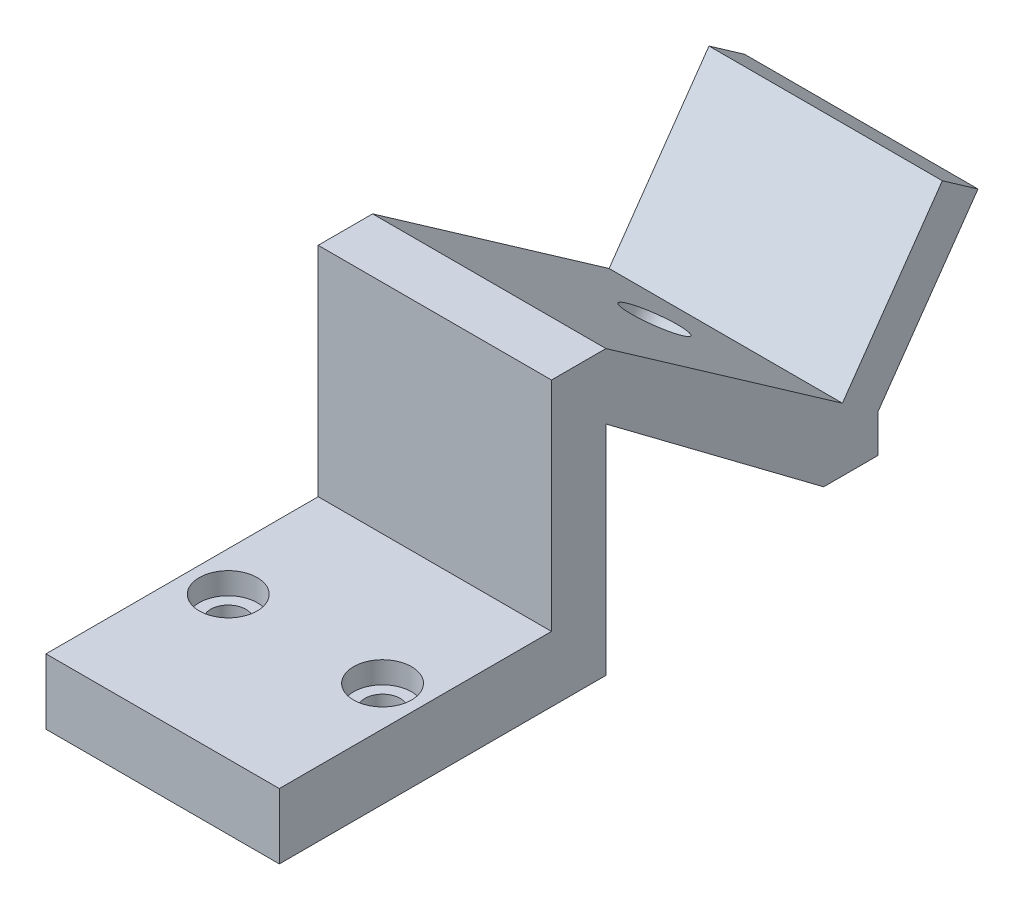
ISO-10303-21;
HEADER;
FILE_DESCRIPTION(('STEP AP214'),'2;1');
FILE_NAME('part.step','',(''),(''),'','','');
FILE_SCHEMA(('AUTOMOTIVE_DESIGN { 1 0 10303 214 1 1 1 1 }'));
ENDSEC;
DATA;
#1=APPLICATION_CONTEXT('core data for automotive mechanical design processes');
#2=APPLICATION_PROTOCOL_DEFINITION('international standard','automotive_design',2000,#1);
#3=PRODUCT_CONTEXT('',#1,'mechanical');
#4=PRODUCT('Part','Part','',(#3));
#5=PRODUCT_RELATED_PRODUCT_CATEGORY('part','',(#4));
#6=PRODUCT_DEFINITION_FORMATION('','',#4);
#7=PRODUCT_DEFINITION_CONTEXT('part definition',#1,'design');
#8=PRODUCT_DEFINITION('design','',#6,#7);
#9=PRODUCT_DEFINITION_SHAPE('','',#8);
#10=(LENGTH_UNIT() NAMED_UNIT(*) SI_UNIT(.MILLI.,.METRE.));
#11=(NAMED_UNIT(*) PLANE_ANGLE_UNIT() SI_UNIT($,.RADIAN.));
#12=(NAMED_UNIT(*) SI_UNIT($,.STERADIAN.) SOLID_ANGLE_UNIT());
#13=UNCERTAINTY_MEASURE_WITH_UNIT(LENGTH_MEASURE(1.E-05),#10,'distance_accuracy_value','');
#14=(GEOMETRIC_REPRESENTATION_CONTEXT(3) GLOBAL_UNCERTAINTY_ASSIGNED_CONTEXT((#13)) GLOBAL_UNIT_ASSIGNED_CONTEXT((#10,
#11,#12)) REPRESENTATION_CONTEXT('',''));
#15=CARTESIAN_POINT('',(0.,0.,0.));
#16=DIRECTION('',(0.,0.,1.));
#17=DIRECTION('',(1.,0.,0.));
#18=AXIS2_PLACEMENT_3D('',#15,#16,#17);
#19=CARTESIAN_POINT('',(-0.3468345323741,9.13032073750534,-41.6646675708252));
#20=DIRECTION('',(0.,0.81923192051904,-0.573462344363328));
#21=DIRECTION('',(0.,0.573462344363328,0.81923192051904));
#22=AXIS2_PLACEMENT_3D('',#19,#20,#21);
#23=CYLINDRICAL_SURFACE('',#22,3.302);
#24=CARTESIAN_POINT('',(-0.346834532374102,19.5345661280972,-48.9476393442395));
#25=DIRECTION('',(0.,0.81923192051904,-0.573462344363329));
#26=DIRECTION('',(0.,0.573462344363329,0.81923192051904));
#27=AXIS2_PLACEMENT_3D('',#24,#25,#26);
#28=CIRCLE('',#27,3.302);
#29=CARTESIAN_POINT('',(-0.346834532374102,21.4281387891849,-46.2425355426856));
#30=VERTEX_POINT('',#29);
#31=EDGE_CURVE('E371',#30,#30,#28,.T.);
#32=ORIENTED_EDGE('',*,*,#31,.T.);
#33=EDGE_LOOP('',(#32));
#34=FACE_BOUND('',#33,.T.);
#35=CARTESIAN_POINT('',(-0.346834532374101,15.9881757828089,-46.4651661025377));
#36=DIRECTION('',(0.,-0.8,0.6));
#37=DIRECTION('',(0.,0.6,0.8));
#38=AXIS2_PLACEMENT_3D('',#35,#36,#37);
#39=ELLIPSE('',#38,3.30377431501252,3.302);
#40=CARTESIAN_POINT('',(-0.346834532374101,17.9704403718165,-43.8221466505277));
#41=VERTEX_POINT('',#40);
#42=EDGE_CURVE('E37',#41,#41,#39,.F.);
#43=ORIENTED_EDGE('',*,*,#42,.F.);
#44=EDGE_LOOP('',(#43));
#45=FACE_BOUND('',#44,.T.);
#46=ADVANCED_FACE('F33',(#34,#45),#23,.F.);
#47=CARTESIAN_POINT('',(13.9831654676259,6.35,-67.7827338129496));
#48=DIRECTION('',(0.,-0.81923192051904,0.573462344363328));
#49=DIRECTION('',(0.,-0.573462344363328,-0.81923192051904));
#50=AXIS2_PLACEMENT_3D('',#47,#48,#49);
#51=PLANE('',#50);
#52=ORIENTED_EDGE('',*,*,#31,.F.);
#53=EDGE_LOOP('',(#52));
#54=FACE_BOUND('',#53,.T.);
#55=DIRECTION('',(1.,0.,0.));
#56=VECTOR('',#55,1.);
#57=CARTESIAN_POINT('',(-13.9568345323741,13.7081887093657,-57.2710356567129));
#58=LINE('',#57,#56);
#59=CARTESIAN_POINT('',(-13.9568345323741,13.7081887093657,-57.2710356567129));
#60=VERTEX_POINT('',#59);
#61=CARTESIAN_POINT('',(13.2631654676259,13.7081887093657,-57.2710356567129));
#62=VERTEX_POINT('',#61);
#63=EDGE_CURVE('E49',#60,#62,#58,.T.);
#64=ORIENTED_EDGE('',*,*,#63,.F.);
#65=DIRECTION('',(0.,0.573462344363328,0.81923192051904));
#66=VECTOR('',#65,1.);
#67=CARTESIAN_POINT('',(-13.9568345323741,6.35,-67.7827338129496));
#68=LINE('',#67,#66);
#69=CARTESIAN_POINT('',(-13.9568345323741,33.02,-29.6827338129496));
#70=VERTEX_POINT('',#69);
#71=EDGE_CURVE('E149',#60,#70,#68,.T.);
#72=ORIENTED_EDGE('',*,*,#71,.T.);
#73=DIRECTION('',(-1.,0.,0.));
#74=VECTOR('',#73,1.);
#75=CARTESIAN_POINT('',(13.9831654676259,33.02,-29.6827338129496));
#76=LINE('',#75,#74);
#77=CARTESIAN_POINT('',(13.2631654676259,33.02,-29.6827338129496));
#78=VERTEX_POINT('',#77);
#79=EDGE_CURVE('E162',#78,#70,#76,.T.);
#80=ORIENTED_EDGE('',*,*,#79,.F.);
#81=DIRECTION('',(0.,0.573462344363328,0.81923192051904));
#82=VECTOR('',#81,1.);
#83=CARTESIAN_POINT('',(13.2631654676259,18.7005369127517,-50.1391096518758));
#84=LINE('',#83,#82);
#85=EDGE_CURVE('E165',#62,#78,#84,.T.);
#86=ORIENTED_EDGE('',*,*,#85,.F.);
#87=EDGE_LOOP('',(#64,#72,#80,#86));
#88=FACE_BOUND('',#87,.T.);
#89=ADVANCED_FACE('F285',(#54,#88),#51,.F.);
#90=CARTESIAN_POINT('',(0.,0.,0.));
#91=DIRECTION('',(0.,1.,0.));
#92=DIRECTION('',(0.,0.,1.));
#93=AXIS2_PLACEMENT_3D('',#90,#91,#92);
#94=PLANE('',#93);
#95=CARTESIAN_POINT('',(-9.3468345323741,0.,-8.23273381294964));
#96=DIRECTION('',(0.,1.,0.));
#97=DIRECTION('',(0.,0.,1.));
#98=AXIS2_PLACEMENT_3D('',#95,#96,#97);
#99=CIRCLE('',#98,2.05);
#100=CARTESIAN_POINT('',(-9.3468345323741,0.,-6.18273381294964));
#101=VERTEX_POINT('',#100);
#102=EDGE_CURVE('E223',#101,#101,#99,.T.);
#103=ORIENTED_EDGE('',*,*,#102,.T.);
#104=EDGE_LOOP('',(#103));
#105=FACE_BOUND('',#104,.T.);
#106=CARTESIAN_POINT('',(8.6531654676259,0.,-8.23273381294964));
#107=DIRECTION('',(0.,-1.,0.));
#108=DIRECTION('',(0.,0.,1.));
#109=AXIS2_PLACEMENT_3D('',#106,#107,#108);
#110=CIRCLE('',#109,2.05);
#111=CARTESIAN_POINT('',(8.6531654676259,0.,-6.18273381294964));
#112=VERTEX_POINT('',#111);
#113=EDGE_CURVE('E213',#112,#112,#110,.T.);
#114=ORIENTED_EDGE('',*,*,#113,.F.);
#115=EDGE_LOOP('',(#114));
#116=FACE_BOUND('',#115,.T.);
#117=DIRECTION('',(-1.,0.,0.));
#118=VECTOR('',#117,1.);
#119=CARTESIAN_POINT('',(-13.9568345323741,0.,-29.6827338129496));
#120=LINE('',#119,#118);
#121=CARTESIAN_POINT('',(13.2631654676259,0.,-29.6827338129496));
#122=VERTEX_POINT('',#121);
#123=CARTESIAN_POINT('',(-13.9568345323741,0.,-29.6827338129496));
#124=VERTEX_POINT('',#123);
#125=EDGE_CURVE('E182',#122,#124,#120,.T.);
#126=ORIENTED_EDGE('',*,*,#125,.F.);
#127=DIRECTION('',(0.,0.,-1.));
#128=VECTOR('',#127,1.);
#129=CARTESIAN_POINT('',(13.2631654676259,0.,-42.3827338129496));
#130=LINE('',#129,#128);
#131=CARTESIAN_POINT('',(13.2631654676259,0.,8.41726618705036));
#132=VERTEX_POINT('',#131);
#133=EDGE_CURVE('E230',#132,#122,#130,.T.);
#134=ORIENTED_EDGE('',*,*,#133,.F.);
#135=DIRECTION('',(1.,0.,0.));
#136=VECTOR('',#135,1.);
#137=CARTESIAN_POINT('',(-13.9568345323741,0.,8.41726618705036));
#138=LINE('',#137,#136);
#139=CARTESIAN_POINT('',(-13.9568345323741,0.,8.41726618705036));
#140=VERTEX_POINT('',#139);
#141=EDGE_CURVE('E236',#140,#132,#138,.T.);
#142=ORIENTED_EDGE('',*,*,#141,.F.);
#143=DIRECTION('',(0.,0.,1.));
#144=VECTOR('',#143,1.);
#145=CARTESIAN_POINT('',(-13.9568345323741,0.,-42.3827338129496));
#146=LINE('',#145,#144);
#147=EDGE_CURVE('E226',#124,#140,#146,.T.);
#148=ORIENTED_EDGE('',*,*,#147,.F.);
#149=EDGE_LOOP('',(#126,#134,#142,#148));
#150=FACE_BOUND('',#149,.T.);
#151=ADVANCED_FACE('F292',(#105,#116,#150),#94,.F.);
#152=CARTESIAN_POINT('',(8.6531654676259,0.,-8.23273381294964));
#153=DIRECTION('',(0.,1.,0.));
#154=DIRECTION('',(0.,0.,1.));
#155=AXIS2_PLACEMENT_3D('',#152,#153,#154);
#156=CYLINDRICAL_SURFACE('',#155,2.05);
#157=CARTESIAN_POINT('',(8.6531654676259,5.08,-8.23273381294964));
#158=DIRECTION('',(0.,1.,0.));
#159=DIRECTION('',(0.,0.,1.));
#160=AXIS2_PLACEMENT_3D('',#157,#158,#159);
#161=CIRCLE('',#160,2.05);
#162=CARTESIAN_POINT('',(8.6531654676259,5.08,-6.18273381294964));
#163=VERTEX_POINT('',#162);
#164=EDGE_CURVE('E210',#163,#163,#161,.T.);
#165=CARTESIAN_POINT('',(8.6531654676259,0.,-6.18273381294964));
#166=CARTESIAN_POINT('',(8.6531654676259,0.0529166666666667,-6.18273381294964));
#167=CARTESIAN_POINT('',(8.6531654676259,0.105833333333333,-6.18273381294964));
#168=CARTESIAN_POINT('',(8.6531654676259,0.211666666666667,-6.18273381294964));
#169=CARTESIAN_POINT('',(8.6531654676259,0.264583333333333,-6.18273381294964));
#170=CARTESIAN_POINT('',(8.6531654676259,0.370416666666667,-6.18273381294964));
#171=CARTESIAN_POINT('',(8.6531654676259,0.423333333333333,-6.18273381294964));
#172=CARTESIAN_POINT('',(8.6531654676259,0.529166666666666,-6.18273381294964));
#173=CARTESIAN_POINT('',(8.6531654676259,0.582083333333333,-6.18273381294964));
#174=CARTESIAN_POINT('',(8.6531654676259,0.687916666666667,-6.18273381294964));
#175=CARTESIAN_POINT('',(8.6531654676259,0.740833333333333,-6.18273381294964));
#176=CARTESIAN_POINT('',(8.6531654676259,0.846666666666666,-6.18273381294964));
#177=CARTESIAN_POINT('',(8.6531654676259,0.899583333333333,-6.18273381294964));
#178=CARTESIAN_POINT('',(8.6531654676259,1.00541666666667,-6.18273381294964));
#179=CARTESIAN_POINT('',(8.6531654676259,1.05833333333333,-6.18273381294964));
#180=CARTESIAN_POINT('',(8.6531654676259,1.16416666666667,-6.18273381294964));
#181=CARTESIAN_POINT('',(8.6531654676259,1.21708333333333,-6.18273381294964));
#182=CARTESIAN_POINT('',(8.6531654676259,1.32291666666667,-6.18273381294964));
#183=CARTESIAN_POINT('',(8.6531654676259,1.37583333333333,-6.18273381294964));
#184=CARTESIAN_POINT('',(8.6531654676259,1.48166666666667,-6.18273381294964));
#185=CARTESIAN_POINT('',(8.6531654676259,1.53458333333333,-6.18273381294964));
#186=CARTESIAN_POINT('',(8.6531654676259,1.64041666666667,-6.18273381294964));
#187=CARTESIAN_POINT('',(8.6531654676259,1.69333333333333,-6.18273381294964));
#188=CARTESIAN_POINT('',(8.6531654676259,1.79916666666667,-6.18273381294964));
#189=CARTESIAN_POINT('',(8.6531654676259,1.85208333333333,-6.18273381294964));
#190=CARTESIAN_POINT('',(8.6531654676259,1.95791666666667,-6.18273381294964));
#191=CARTESIAN_POINT('',(8.6531654676259,2.01083333333333,-6.18273381294964));
#192=CARTESIAN_POINT('',(8.6531654676259,2.11666666666667,-6.18273381294964));
#193=CARTESIAN_POINT('',(8.6531654676259,2.16958333333333,-6.18273381294964));
#194=CARTESIAN_POINT('',(8.6531654676259,2.27541666666667,-6.18273381294964));
#195=CARTESIAN_POINT('',(8.6531654676259,2.32833333333333,-6.18273381294964));
#196=CARTESIAN_POINT('',(8.6531654676259,2.43416666666667,-6.18273381294964));
#197=CARTESIAN_POINT('',(8.6531654676259,2.48708333333333,-6.18273381294964));
#198=CARTESIAN_POINT('',(8.6531654676259,2.59291666666667,-6.18273381294964));
#199=CARTESIAN_POINT('',(8.6531654676259,2.64583333333333,-6.18273381294964));
#200=CARTESIAN_POINT('',(8.6531654676259,2.75166666666667,-6.18273381294964));
#201=CARTESIAN_POINT('',(8.6531654676259,2.80458333333333,-6.18273381294964));
#202=CARTESIAN_POINT('',(8.6531654676259,2.91041666666667,-6.18273381294964));
#203=CARTESIAN_POINT('',(8.6531654676259,2.96333333333333,-6.18273381294964));
#204=CARTESIAN_POINT('',(8.6531654676259,3.06916666666667,-6.18273381294964));
#205=CARTESIAN_POINT('',(8.6531654676259,3.12208333333333,-6.18273381294964));
#206=CARTESIAN_POINT('',(8.6531654676259,3.22791666666667,-6.18273381294964));
#207=CARTESIAN_POINT('',(8.6531654676259,3.28083333333333,-6.18273381294964));
#208=CARTESIAN_POINT('',(8.6531654676259,3.38666666666667,-6.18273381294964));
#209=CARTESIAN_POINT('',(8.6531654676259,3.43958333333333,-6.18273381294964));
#210=CARTESIAN_POINT('',(8.6531654676259,3.54541666666667,-6.18273381294964));
#211=CARTESIAN_POINT('',(8.6531654676259,3.59833333333333,-6.18273381294964));
#212=CARTESIAN_POINT('',(8.6531654676259,3.70416666666667,-6.18273381294964));
#213=CARTESIAN_POINT('',(8.6531654676259,3.75708333333333,-6.18273381294964));
#214=CARTESIAN_POINT('',(8.6531654676259,3.86291666666667,-6.18273381294964));
#215=CARTESIAN_POINT('',(8.6531654676259,3.91583333333333,-6.18273381294964));
#216=CARTESIAN_POINT('',(8.6531654676259,4.02166666666666,-6.18273381294964));
#217=CARTESIAN_POINT('',(8.6531654676259,4.07458333333333,-6.18273381294964));
#218=CARTESIAN_POINT('',(8.6531654676259,4.18041666666667,-6.18273381294964));
#219=CARTESIAN_POINT('',(8.6531654676259,4.23333333333333,-6.18273381294964));
#220=CARTESIAN_POINT('',(8.6531654676259,4.33916666666666,-6.18273381294964));
#221=CARTESIAN_POINT('',(8.6531654676259,4.39208333333333,-6.18273381294964));
#222=CARTESIAN_POINT('',(8.6531654676259,4.49791666666667,-6.18273381294964));
#223=CARTESIAN_POINT('',(8.6531654676259,4.55083333333333,-6.18273381294964));
#224=CARTESIAN_POINT('',(8.6531654676259,4.65666666666666,-6.18273381294964));
#225=CARTESIAN_POINT('',(8.6531654676259,4.70958333333333,-6.18273381294964));
#226=CARTESIAN_POINT('',(8.6531654676259,4.81541666666666,-6.18273381294964));
#227=CARTESIAN_POINT('',(8.6531654676259,4.86833333333333,-6.18273381294964));
#228=CARTESIAN_POINT('',(8.6531654676259,4.97416666666667,-6.18273381294964));
#229=CARTESIAN_POINT('',(8.6531654676259,5.02708333333333,-6.18273381294964));
#230=CARTESIAN_POINT('',(8.6531654676259,5.08,-6.18273381294964));
#231=B_SPLINE_CURVE_WITH_KNOTS('',3,(#165,#166,#167,#168,#169,#170,#171,#172,#173,#174,#175,
#176,#177,#178,#179,#180,#181,#182,#183,#184,#185,#186,#187,#188,#189,#190,#191,#192,#193,#194,
#195,#196,#197,#198,#199,#200,#201,#202,#203,#204,#205,#206,#207,#208,#209,#210,#211,#212,#213,
#214,#215,#216,#217,#218,#219,#220,#221,#222,#223,#224,#225,#226,#227,#228,#229,#230),
.UNSPECIFIED.,.F.,.F.,(4,2,2,2,2,2,2,2,2,2,2,2,2,2,2,2,2,2,2,2,2,2,2,2,2,2,2,2,2,2,2,2,4),(0.,
0.15875,0.3175,0.47625,0.635,0.79375,0.9525,1.11125,1.27,1.42875,1.5875,1.74625,1.905,2.06375,
2.2225,2.38125,2.54,2.69875,2.8575,3.01625,3.175,3.33375,3.4925,3.65125,3.81,3.96875,4.1275,
4.28625,4.445,4.60375,4.7625,4.92125,5.08),.UNSPECIFIED.);
#232=EDGE_CURVE('BSEAM249',#112,#163,#231,.T.);
#233=ORIENTED_EDGE('',*,*,#113,.T.);
#234=ORIENTED_EDGE('',*,*,#164,.T.);
#235=ORIENTED_EDGE('',*,*,#232,.T.);
#236=ORIENTED_EDGE('',*,*,#232,.F.);
#237=EDGE_LOOP('',(#233,#235,#234,#236));
#238=FACE_BOUND('',#237,.T.);
#239=ADVANCED_FACE('F249',(#238),#156,.F.);
#240=CARTESIAN_POINT('',(-9.3468345323741,0.,-8.23273381294964));
#241=DIRECTION('',(0.,1.,0.));
#242=DIRECTION('',(0.,0.,1.));
#243=AXIS2_PLACEMENT_3D('',#240,#241,#242);
#244=CYLINDRICAL_SURFACE('',#243,2.05);
#245=CARTESIAN_POINT('',(-9.3468345323741,5.08,-8.23273381294964));
#246=DIRECTION('',(0.,1.,0.));
#247=DIRECTION('',(0.,0.,1.));
#248=AXIS2_PLACEMENT_3D('',#245,#246,#247);
#249=CIRCLE('',#248,2.05);
#250=CARTESIAN_POINT('',(-9.3468345323741,5.08,-6.18273381294964));
#251=VERTEX_POINT('',#250);
#252=EDGE_CURVE('E220',#251,#251,#249,.F.);
#253=CARTESIAN_POINT('',(-9.3468345323741,0.,-6.18273381294964));
#254=CARTESIAN_POINT('',(-9.3468345323741,0.0529166666666667,-6.18273381294964));
#255=CARTESIAN_POINT('',(-9.3468345323741,0.105833333333333,-6.18273381294964));
#256=CARTESIAN_POINT('',(-9.3468345323741,0.211666666666667,-6.18273381294964));
#257=CARTESIAN_POINT('',(-9.3468345323741,0.264583333333333,-6.18273381294964));
#258=CARTESIAN_POINT('',(-9.3468345323741,0.370416666666667,-6.18273381294964));
#259=CARTESIAN_POINT('',(-9.3468345323741,0.423333333333333,-6.18273381294964));
#260=CARTESIAN_POINT('',(-9.3468345323741,0.529166666666666,-6.18273381294964));
#261=CARTESIAN_POINT('',(-9.3468345323741,0.582083333333333,-6.18273381294964));
#262=CARTESIAN_POINT('',(-9.3468345323741,0.687916666666667,-6.18273381294964));
#263=CARTESIAN_POINT('',(-9.3468345323741,0.740833333333333,-6.18273381294964));
#264=CARTESIAN_POINT('',(-9.3468345323741,0.846666666666666,-6.18273381294964));
#265=CARTESIAN_POINT('',(-9.3468345323741,0.899583333333333,-6.18273381294964));
#266=CARTESIAN_POINT('',(-9.3468345323741,1.00541666666667,-6.18273381294964));
#267=CARTESIAN_POINT('',(-9.3468345323741,1.05833333333333,-6.18273381294964));
#268=CARTESIAN_POINT('',(-9.3468345323741,1.16416666666667,-6.18273381294964));
#269=CARTESIAN_POINT('',(-9.3468345323741,1.21708333333333,-6.18273381294964));
#270=CARTESIAN_POINT('',(-9.3468345323741,1.32291666666667,-6.18273381294964));
#271=CARTESIAN_POINT('',(-9.3468345323741,1.37583333333333,-6.18273381294964));
#272=CARTESIAN_POINT('',(-9.3468345323741,1.48166666666667,-6.18273381294964));
#273=CARTESIAN_POINT('',(-9.3468345323741,1.53458333333333,-6.18273381294964));
#274=CARTESIAN_POINT('',(-9.3468345323741,1.64041666666667,-6.18273381294964));
#275=CARTESIAN_POINT('',(-9.3468345323741,1.69333333333333,-6.18273381294964));
#276=CARTESIAN_POINT('',(-9.3468345323741,1.79916666666667,-6.18273381294964));
#277=CARTESIAN_POINT('',(-9.3468345323741,1.85208333333333,-6.18273381294964));
#278=CARTESIAN_POINT('',(-9.3468345323741,1.95791666666667,-6.18273381294964));
#279=CARTESIAN_POINT('',(-9.3468345323741,2.01083333333333,-6.18273381294964));
#280=CARTESIAN_POINT('',(-9.3468345323741,2.11666666666667,-6.18273381294964));
#281=CARTESIAN_POINT('',(-9.3468345323741,2.16958333333333,-6.18273381294964));
#282=CARTESIAN_POINT('',(-9.3468345323741,2.27541666666667,-6.18273381294964));
#283=CARTESIAN_POINT('',(-9.3468345323741,2.32833333333333,-6.18273381294964));
#284=CARTESIAN_POINT('',(-9.3468345323741,2.43416666666667,-6.18273381294964));
#285=CARTESIAN_POINT('',(-9.3468345323741,2.48708333333333,-6.18273381294964));
#286=CARTESIAN_POINT('',(-9.3468345323741,2.59291666666667,-6.18273381294964));
#287=CARTESIAN_POINT('',(-9.3468345323741,2.64583333333333,-6.18273381294964));
#288=CARTESIAN_POINT('',(-9.3468345323741,2.75166666666667,-6.18273381294964));
#289=CARTESIAN_POINT('',(-9.3468345323741,2.80458333333333,-6.18273381294964));
#290=CARTESIAN_POINT('',(-9.3468345323741,2.91041666666667,-6.18273381294964));
#291=CARTESIAN_POINT('',(-9.3468345323741,2.96333333333333,-6.18273381294964));
#292=CARTESIAN_POINT('',(-9.3468345323741,3.06916666666667,-6.18273381294964));
#293=CARTESIAN_POINT('',(-9.3468345323741,3.12208333333333,-6.18273381294964));
#294=CARTESIAN_POINT('',(-9.3468345323741,3.22791666666667,-6.18273381294964));
#295=CARTESIAN_POINT('',(-9.3468345323741,3.28083333333333,-6.18273381294964));
#296=CARTESIAN_POINT('',(-9.3468345323741,3.38666666666667,-6.18273381294964));
#297=CARTESIAN_POINT('',(-9.3468345323741,3.43958333333333,-6.18273381294964));
#298=CARTESIAN_POINT('',(-9.3468345323741,3.54541666666667,-6.18273381294964));
#299=CARTESIAN_POINT('',(-9.3468345323741,3.59833333333333,-6.18273381294964));
#300=CARTESIAN_POINT('',(-9.3468345323741,3.70416666666667,-6.18273381294964));
#301=CARTESIAN_POINT('',(-9.3468345323741,3.75708333333333,-6.18273381294964));
#302=CARTESIAN_POINT('',(-9.3468345323741,3.86291666666667,-6.18273381294964));
#303=CARTESIAN_POINT('',(-9.3468345323741,3.91583333333333,-6.18273381294964));
#304=CARTESIAN_POINT('',(-9.3468345323741,4.02166666666666,-6.18273381294964));
#305=CARTESIAN_POINT('',(-9.3468345323741,4.07458333333333,-6.18273381294964));
#306=CARTESIAN_POINT('',(-9.3468345323741,4.18041666666667,-6.18273381294964));
#307=CARTESIAN_POINT('',(-9.3468345323741,4.23333333333333,-6.18273381294964));
#308=CARTESIAN_POINT('',(-9.3468345323741,4.33916666666666,-6.18273381294964));
#309=CARTESIAN_POINT('',(-9.3468345323741,4.39208333333333,-6.18273381294964));
#310=CARTESIAN_POINT('',(-9.3468345323741,4.49791666666667,-6.18273381294964));
#311=CARTESIAN_POINT('',(-9.3468345323741,4.55083333333333,-6.18273381294964));
#312=CARTESIAN_POINT('',(-9.3468345323741,4.65666666666666,-6.18273381294964));
#313=CARTESIAN_POINT('',(-9.3468345323741,4.70958333333333,-6.18273381294964));
#314=CARTESIAN_POINT('',(-9.3468345323741,4.81541666666666,-6.18273381294964));
#315=CARTESIAN_POINT('',(-9.3468345323741,4.86833333333333,-6.18273381294964));
#316=CARTESIAN_POINT('',(-9.3468345323741,4.97416666666667,-6.18273381294964));
#317=CARTESIAN_POINT('',(-9.3468345323741,5.02708333333333,-6.18273381294964));
#318=CARTESIAN_POINT('',(-9.3468345323741,5.08,-6.18273381294964));
#319=B_SPLINE_CURVE_WITH_KNOTS('',3,(#253,#254,#255,#256,#257,#258,#259,#260,#261,#262,#263,
#264,#265,#266,#267,#268,#269,#270,#271,#272,#273,#274,#275,#276,#277,#278,#279,#280,#281,#282,
#283,#284,#285,#286,#287,#288,#289,#290,#291,#292,#293,#294,#295,#296,#297,#298,#299,#300,#301,
#302,#303,#304,#305,#306,#307,#308,#309,#310,#311,#312,#313,#314,#315,#316,#317,#318),
.UNSPECIFIED.,.F.,.F.,(4,2,2,2,2,2,2,2,2,2,2,2,2,2,2,2,2,2,2,2,2,2,2,2,2,2,2,2,2,2,2,2,4),(0.,
0.15875,0.3175,0.47625,0.635,0.79375,0.9525,1.11125,1.27,1.42875,1.5875,1.74625,1.905,2.06375,
2.2225,2.38125,2.54,2.69875,2.8575,3.01625,3.175,3.33375,3.4925,3.65125,3.81,3.96875,4.1275,
4.28625,4.445,4.60375,4.7625,4.92125,5.08),.UNSPECIFIED.);
#320=EDGE_CURVE('BSEAM333',#101,#251,#319,.T.);
#321=ORIENTED_EDGE('',*,*,#102,.F.);
#322=ORIENTED_EDGE('',*,*,#252,.F.);
#323=ORIENTED_EDGE('',*,*,#320,.T.);
#324=ORIENTED_EDGE('',*,*,#320,.F.);
#325=EDGE_LOOP('',(#321,#323,#322,#324));
#326=FACE_BOUND('',#325,.T.);
#327=ADVANCED_FACE('F333',(#326),#244,.F.);
#328=CARTESIAN_POINT('',(-13.9568345323741,7.62,-42.3827338129496));
#329=DIRECTION('',(1.,0.,0.));
#330=DIRECTION('',(0.,0.,-1.));
#331=AXIS2_PLACEMENT_3D('',#328,#329,#330);
#332=PLANE('',#331);
#333=ORIENTED_EDGE('',*,*,#71,.F.);
#334=DIRECTION('',(0.,-0.81923192051904,0.573462344363328));
#335=VECTOR('',#334,1.);
#336=CARTESIAN_POINT('',(-13.9568345323741,30.3549813343126,-68.9237904941757));
#337=LINE('',#336,#335);
#338=CARTESIAN_POINT('',(-13.9568345323741,30.3549813343126,-68.9237904941757));
#339=VERTEX_POINT('',#338);
#340=EDGE_CURVE('E132',#339,#60,#337,.T.);
#341=ORIENTED_EDGE('',*,*,#340,.F.);
#342=DIRECTION('',(0.,0.573462344363329,0.81923192051904));
#343=VECTOR('',#342,1.);
#344=CARTESIAN_POINT('',(-13.9568345323741,27.4417926249469,-73.0854886504125));
#345=LINE('',#344,#343);
#346=CARTESIAN_POINT('',(-13.9568345323741,27.4417926249469,-73.0854886504125));
#347=VERTEX_POINT('',#346);
#348=EDGE_CURVE('E138',#347,#339,#345,.T.);
#349=ORIENTED_EDGE('',*,*,#348,.F.);
#350=DIRECTION('',(0.,-0.81923192051904,0.573462344363328));
#351=VECTOR('',#350,1.);
#352=CARTESIAN_POINT('',(-13.9568345323741,27.4417926249469,-73.0854886504125));
#353=LINE('',#352,#351);
#354=CARTESIAN_POINT('',(-13.9568345323741,10.795,-61.4327338129496));
#355=VERTEX_POINT('',#354);
#356=EDGE_CURVE('E366',#347,#355,#353,.T.);
#357=ORIENTED_EDGE('',*,*,#356,.T.);
#358=DIRECTION('',(0.,1.,0.));
#359=VECTOR('',#358,1.);
#360=CARTESIAN_POINT('',(-13.9568345323741,6.35,-61.4327338129496));
#361=LINE('',#360,#359);
#362=CARTESIAN_POINT('',(-13.9568345323741,6.35,-61.4327338129496));
#363=VERTEX_POINT('',#362);
#364=EDGE_CURVE('E57',#363,#355,#361,.T.);
#365=ORIENTED_EDGE('',*,*,#364,.F.);
#366=DIRECTION('',(0.,0.,-1.));
#367=VECTOR('',#366,1.);
#368=CARTESIAN_POINT('',(-13.9568345323741,6.35,-29.6827338129496));
#369=LINE('',#368,#367);
#370=CARTESIAN_POINT('',(-13.9568345323741,6.35,-55.0827338129496));
#371=VERTEX_POINT('',#370);
#372=EDGE_CURVE('E184',#371,#363,#369,.T.);
#373=ORIENTED_EDGE('',*,*,#372,.F.);
#374=DIRECTION('',(0.,-0.6,-0.8));
#375=VECTOR('',#374,1.);
#376=CARTESIAN_POINT('',(-13.9568345323741,25.4,-29.6827338129496));
#377=LINE('',#376,#375);
#378=CARTESIAN_POINT('',(-13.9568345323741,25.4,-29.6827338129496));
#379=VERTEX_POINT('',#378);
#380=EDGE_CURVE('E167',#379,#371,#377,.T.);
#381=ORIENTED_EDGE('',*,*,#380,.F.);
#382=DIRECTION('',(0.,1.,0.));
#383=VECTOR('',#382,1.);
#384=CARTESIAN_POINT('',(-13.9568345323741,0.,-29.6827338129496));
#385=LINE('',#384,#383);
#386=EDGE_CURVE('E178',#124,#379,#385,.T.);
#387=ORIENTED_EDGE('',*,*,#386,.F.);
#388=ORIENTED_EDGE('',*,*,#147,.T.);
#389=DIRECTION('',(0.,-1.,0.));
#390=VECTOR('',#389,1.);
#391=CARTESIAN_POINT('',(-13.9568345323741,7.62,8.41726618705036));
#392=LINE('',#391,#390);
#393=CARTESIAN_POINT('',(-13.9568345323741,7.62,8.41726618705036));
#394=VERTEX_POINT('',#393);
#395=EDGE_CURVE('E42',#394,#140,#392,.T.);
#396=ORIENTED_EDGE('',*,*,#395,.F.);
#397=DIRECTION('',(0.,0.,1.));
#398=VECTOR('',#397,1.);
#399=CARTESIAN_POINT('',(-13.9568345323741,7.62,-42.3827338129496));
#400=LINE('',#399,#398);
#401=CARTESIAN_POINT('',(-13.9568345323741,7.62,-23.3327338129496));
#402=VERTEX_POINT('',#401);
#403=EDGE_CURVE('E227',#402,#394,#400,.T.);
#404=ORIENTED_EDGE('',*,*,#403,.F.);
#405=DIRECTION('',(0.,-1.,0.));
#406=VECTOR('',#405,1.);
#407=CARTESIAN_POINT('',(-13.9568345323741,33.02,-23.3327338129496));
#408=LINE('',#407,#406);
#409=CARTESIAN_POINT('',(-13.9568345323741,33.02,-23.3327338129496));
#410=VERTEX_POINT('',#409);
#411=EDGE_CURVE('E203',#410,#402,#408,.T.);
#412=ORIENTED_EDGE('',*,*,#411,.F.);
#413=DIRECTION('',(0.,0.,1.));
#414=VECTOR('',#413,1.);
#415=CARTESIAN_POINT('',(-13.9568345323741,33.02,-42.3827338129496));
#416=LINE('',#415,#414);
#417=EDGE_CURVE('E191',#70,#410,#416,.T.);
#418=ORIENTED_EDGE('',*,*,#417,.F.);
#419=EDGE_LOOP('',(#333,#341,#349,#357,#365,#373,#381,#387,#388,#396,#404,#412,#418));
#420=FACE_BOUND('',#419,.T.);
#421=ADVANCED_FACE('F35',(#420),#332,.F.);
#422=CARTESIAN_POINT('',(-13.9568345323741,7.62,8.41726618705036));
#423=DIRECTION('',(0.,0.,-1.));
#424=DIRECTION('',(-1.,0.,0.));
#425=AXIS2_PLACEMENT_3D('',#422,#423,#424);
#426=PLANE('',#425);
#427=ORIENTED_EDGE('',*,*,#141,.T.);
#428=DIRECTION('',(0.,-1.,0.));
#429=VECTOR('',#428,1.);
#430=CARTESIAN_POINT('',(13.2631654676259,7.62,8.41726618705036));
#431=LINE('',#430,#429);
#432=CARTESIAN_POINT('',(13.2631654676259,7.62,8.41726618705036));
#433=VERTEX_POINT('',#432);
#434=EDGE_CURVE('E234',#433,#132,#431,.T.);
#435=ORIENTED_EDGE('',*,*,#434,.F.);
#436=DIRECTION('',(1.,0.,0.));
#437=VECTOR('',#436,1.);
#438=CARTESIAN_POINT('',(-13.9568345323741,7.62,8.41726618705036));
#439=LINE('',#438,#437);
#440=EDGE_CURVE('E229',#394,#433,#439,.T.);
#441=ORIENTED_EDGE('',*,*,#440,.F.);
#442=ORIENTED_EDGE('',*,*,#395,.T.);
#443=EDGE_LOOP('',(#427,#435,#441,#442));
#444=FACE_BOUND('',#443,.T.);
#445=ADVANCED_FACE('F356',(#444),#426,.F.);
#446=CARTESIAN_POINT('',(13.2631654676259,7.62,-42.3827338129496));
#447=DIRECTION('',(-1.,0.,0.));
#448=DIRECTION('',(0.,0.,1.));
#449=AXIS2_PLACEMENT_3D('',#446,#447,#448);
#450=PLANE('',#449);
#451=DIRECTION('',(0.,0.,-1.));
#452=VECTOR('',#451,1.);
#453=CARTESIAN_POINT('',(13.2631654676259,6.35,-29.6827338129496));
#454=LINE('',#453,#452);
#455=CARTESIAN_POINT('',(13.2631654676259,6.35,-55.0827338129496));
#456=VERTEX_POINT('',#455);
#457=CARTESIAN_POINT('',(13.2631654676259,6.35,-61.4327338129496));
#458=VERTEX_POINT('',#457);
#459=EDGE_CURVE('E185',#456,#458,#454,.T.);
#460=ORIENTED_EDGE('',*,*,#459,.T.);
#461=DIRECTION('',(0.,1.,0.));
#462=VECTOR('',#461,1.);
#463=CARTESIAN_POINT('',(13.2631654676259,7.62,-61.4327338129496));
#464=LINE('',#463,#462);
#465=CARTESIAN_POINT('',(13.2631654676259,10.795,-61.4327338129496));
#466=VERTEX_POINT('',#465);
#467=EDGE_CURVE('E158',#458,#466,#464,.T.);
#468=ORIENTED_EDGE('',*,*,#467,.T.);
#469=DIRECTION('',(0.,-0.81923192051904,0.573462344363328));
#470=VECTOR('',#469,1.);
#471=CARTESIAN_POINT('',(13.2631654676259,27.4417926249469,-73.0854886504125));
#472=LINE('',#471,#470);
#473=CARTESIAN_POINT('',(13.2631654676259,27.4417926249469,-73.0854886504125));
#474=VERTEX_POINT('',#473);
#475=EDGE_CURVE('E153',#474,#466,#472,.T.);
#476=ORIENTED_EDGE('',*,*,#475,.F.);
#477=DIRECTION('',(0.,-0.573462344363329,-0.81923192051904));
#478=VECTOR('',#477,1.);
#479=CARTESIAN_POINT('',(13.2631654676259,27.4417926249469,-73.0854886504125));
#480=LINE('',#479,#478);
#481=CARTESIAN_POINT('',(13.2631654676259,30.3549813343126,-68.9237904941757));
#482=VERTEX_POINT('',#481);
#483=EDGE_CURVE('E137',#482,#474,#480,.T.);
#484=ORIENTED_EDGE('',*,*,#483,.F.);
#485=DIRECTION('',(0.,-0.81923192051904,0.573462344363328));
#486=VECTOR('',#485,1.);
#487=CARTESIAN_POINT('',(13.2631654676259,30.3549813343126,-68.9237904941757));
#488=LINE('',#487,#486);
#489=EDGE_CURVE('E134',#482,#62,#488,.T.);
#490=ORIENTED_EDGE('',*,*,#489,.T.);
#491=ORIENTED_EDGE('',*,*,#85,.T.);
#492=DIRECTION('',(0.,0.,-1.));
#493=VECTOR('',#492,1.);
#494=CARTESIAN_POINT('',(13.2631654676259,33.02,-42.3827338129496));
#495=LINE('',#494,#493);
#496=CARTESIAN_POINT('',(13.2631654676259,33.02,-23.3327338129496));
#497=VERTEX_POINT('',#496);
#498=EDGE_CURVE('E195',#497,#78,#495,.T.);
#499=ORIENTED_EDGE('',*,*,#498,.F.);
#500=DIRECTION('',(0.,-1.,0.));
#501=VECTOR('',#500,1.);
#502=CARTESIAN_POINT('',(13.2631654676259,33.02,-23.3327338129496));
#503=LINE('',#502,#501);
#504=CARTESIAN_POINT('',(13.2631654676259,7.62,-23.3327338129496));
#505=VERTEX_POINT('',#504);
#506=EDGE_CURVE('E198',#497,#505,#503,.T.);
#507=ORIENTED_EDGE('',*,*,#506,.T.);
#508=DIRECTION('',(0.,0.,-1.));
#509=VECTOR('',#508,1.);
#510=CARTESIAN_POINT('',(13.2631654676259,7.62,-42.3827338129496));
#511=LINE('',#510,#509);
#512=EDGE_CURVE('E232',#433,#505,#511,.T.);
#513=ORIENTED_EDGE('',*,*,#512,.F.);
#514=ORIENTED_EDGE('',*,*,#434,.T.);
#515=ORIENTED_EDGE('',*,*,#133,.T.);
#516=DIRECTION('',(0.,-1.,0.));
#517=VECTOR('',#516,1.);
#518=CARTESIAN_POINT('',(13.2631654676259,0.,-29.6827338129496));
#519=LINE('',#518,#517);
#520=CARTESIAN_POINT('',(13.2631654676259,25.4,-29.6827338129496));
#521=VERTEX_POINT('',#520);
#522=EDGE_CURVE('E180',#521,#122,#519,.T.);
#523=ORIENTED_EDGE('',*,*,#522,.F.);
#524=DIRECTION('',(0.,-0.6,-0.8));
#525=VECTOR('',#524,1.);
#526=CARTESIAN_POINT('',(13.2631654676259,12.9032,-46.3451338129496));
#527=LINE('',#526,#525);
#528=EDGE_CURVE('E173',#521,#456,#527,.T.);
#529=ORIENTED_EDGE('',*,*,#528,.T.);
#530=EDGE_LOOP('',(#460,#468,#476,#484,#490,#491,#499,#507,#513,#514,#515,#523,#529));
#531=FACE_BOUND('',#530,.T.);
#532=ADVANCED_FACE('F269',(#531),#450,.F.);
#533=CARTESIAN_POINT('',(0.,7.62,0.));
#534=DIRECTION('',(0.,1.,0.));
#535=DIRECTION('',(0.,0.,1.));
#536=AXIS2_PLACEMENT_3D('',#533,#534,#535);
#537=PLANE('',#536);
#538=DIRECTION('',(1.,0.,0.));
#539=VECTOR('',#538,1.);
#540=CARTESIAN_POINT('',(-13.9568345323741,7.62,-23.3327338129496));
#541=LINE('',#540,#539);
#542=EDGE_CURVE('E188',#402,#505,#541,.T.);
#543=ORIENTED_EDGE('',*,*,#542,.F.);
#544=ORIENTED_EDGE('',*,*,#403,.T.);
#545=ORIENTED_EDGE('',*,*,#440,.T.);
#546=ORIENTED_EDGE('',*,*,#512,.T.);
#547=EDGE_LOOP('',(#543,#544,#545,#546));
#548=FACE_BOUND('',#547,.T.);
#549=CARTESIAN_POINT('',(8.6531654676259,7.62,-8.23273381294964));
#550=DIRECTION('',(0.,-1.,0.));
#551=DIRECTION('',(0.,0.,1.));
#552=AXIS2_PLACEMENT_3D('',#549,#550,#551);
#553=CIRCLE('',#552,3.3782);
#554=CARTESIAN_POINT('',(8.6531654676259,7.62,-4.85453381294964));
#555=VERTEX_POINT('',#554);
#556=EDGE_CURVE('E206',#555,#555,#553,.T.);
#557=ORIENTED_EDGE('',*,*,#556,.T.);
#558=EDGE_LOOP('',(#557));
#559=FACE_BOUND('',#558,.T.);
#560=CARTESIAN_POINT('',(-9.3468345323741,7.62,-8.23273381294964));
#561=DIRECTION('',(0.,1.,0.));
#562=DIRECTION('',(0.,0.,1.));
#563=AXIS2_PLACEMENT_3D('',#560,#561,#562);
#564=CIRCLE('',#563,3.3782);
#565=CARTESIAN_POINT('',(-9.3468345323741,7.62,-4.85453381294964));
#566=VERTEX_POINT('',#565);
#567=EDGE_CURVE('E216',#566,#566,#564,.T.);
#568=ORIENTED_EDGE('',*,*,#567,.F.);
#569=EDGE_LOOP('',(#568));
#570=FACE_BOUND('',#569,.T.);
#571=ADVANCED_FACE('F265',(#548,#559,#570),#537,.T.);
#572=CARTESIAN_POINT('',(-9.3468345323741,5.08,-8.23273381294964));
#573=DIRECTION('',(0.,1.,0.));
#574=DIRECTION('',(0.,0.,1.));
#575=AXIS2_PLACEMENT_3D('',#572,#573,#574);
#576=PLANE('',#575);
#577=CARTESIAN_POINT('',(-9.3468345323741,5.08,-8.23273381294964));
#578=DIRECTION('',(0.,1.,0.));
#579=DIRECTION('',(0.,0.,1.));
#580=AXIS2_PLACEMENT_3D('',#577,#578,#579);
#581=CIRCLE('',#580,3.3782);
#582=CARTESIAN_POINT('',(-9.3468345323741,5.08,-4.85453381294964));
#583=VERTEX_POINT('',#582);
#584=EDGE_CURVE('E217',#583,#583,#581,.T.);
#585=ORIENTED_EDGE('',*,*,#584,.T.);
#586=EDGE_LOOP('',(#585));
#587=FACE_BOUND('',#586,.T.);
#588=ORIENTED_EDGE('',*,*,#252,.T.);
#589=EDGE_LOOP('',(#588));
#590=FACE_BOUND('',#589,.T.);
#591=ADVANCED_FACE('F268',(#587,#590),#576,.T.);
#592=CARTESIAN_POINT('',(-9.3468345323741,5.08,-8.23273381294964));
#593=DIRECTION('',(0.,1.,0.));
#594=DIRECTION('',(0.,0.,1.));
#595=AXIS2_PLACEMENT_3D('',#592,#593,#594);
#596=CYLINDRICAL_SURFACE('',#595,3.3782);
#597=ORIENTED_EDGE('',*,*,#584,.F.);
#598=EDGE_LOOP('',(#597));
#599=FACE_BOUND('',#598,.T.);
#600=ORIENTED_EDGE('',*,*,#567,.T.);
#601=EDGE_LOOP('',(#600));
#602=FACE_BOUND('',#601,.T.);
#603=ADVANCED_FACE('F261',(#599,#602),#596,.F.);
#604=CARTESIAN_POINT('',(8.6531654676259,5.08,-8.23273381294964));
#605=DIRECTION('',(0.,1.,0.));
#606=DIRECTION('',(0.,0.,1.));
#607=AXIS2_PLACEMENT_3D('',#604,#605,#606);
#608=CYLINDRICAL_SURFACE('',#607,3.3782);
#609=CARTESIAN_POINT('',(8.6531654676259,5.08,-8.23273381294964));
#610=DIRECTION('',(0.,-1.,0.));
#611=DIRECTION('',(0.,0.,1.));
#612=AXIS2_PLACEMENT_3D('',#609,#610,#611);
#613=CIRCLE('',#612,3.3782);
#614=CARTESIAN_POINT('',(8.6531654676259,5.08,-4.85453381294964));
#615=VERTEX_POINT('',#614);
#616=EDGE_CURVE('E207',#615,#615,#613,.T.);
#617=ORIENTED_EDGE('',*,*,#616,.T.);
#618=EDGE_LOOP('',(#617));
#619=FACE_BOUND('',#618,.T.);
#620=ORIENTED_EDGE('',*,*,#556,.F.);
#621=EDGE_LOOP('',(#620));
#622=FACE_BOUND('',#621,.T.);
#623=ADVANCED_FACE('F255',(#619,#622),#608,.F.);
#624=CARTESIAN_POINT('',(8.6531654676259,5.08,-8.23273381294964));
#625=DIRECTION('',(0.,1.,0.));
#626=DIRECTION('',(0.,0.,1.));
#627=AXIS2_PLACEMENT_3D('',#624,#625,#626);
#628=PLANE('',#627);
#629=ORIENTED_EDGE('',*,*,#164,.F.);
#630=EDGE_LOOP('',(#629));
#631=FACE_BOUND('',#630,.T.);
#632=ORIENTED_EDGE('',*,*,#616,.F.);
#633=EDGE_LOOP('',(#632));
#634=FACE_BOUND('',#633,.T.);
#635=ADVANCED_FACE('F251',(#631,#634),#628,.T.);
#636=CARTESIAN_POINT('',(-13.9568345323741,33.02,-23.3327338129496));
#637=DIRECTION('',(0.,0.,-1.));
#638=DIRECTION('',(-1.,0.,0.));
#639=AXIS2_PLACEMENT_3D('',#636,#637,#638);
#640=PLANE('',#639);
#641=ORIENTED_EDGE('',*,*,#542,.T.);
#642=ORIENTED_EDGE('',*,*,#506,.F.);
#643=DIRECTION('',(1.,0.,0.));
#644=VECTOR('',#643,1.);
#645=CARTESIAN_POINT('',(-13.9568345323741,33.02,-23.3327338129496));
#646=LINE('',#645,#644);
#647=EDGE_CURVE('E193',#410,#497,#646,.T.);
#648=ORIENTED_EDGE('',*,*,#647,.F.);
#649=ORIENTED_EDGE('',*,*,#411,.T.);
#650=EDGE_LOOP('',(#641,#642,#648,#649));
#651=FACE_BOUND('',#650,.T.);
#652=ADVANCED_FACE('F254',(#651),#640,.F.);
#653=CARTESIAN_POINT('',(0.,33.02,0.));
#654=DIRECTION('',(0.,1.,0.));
#655=DIRECTION('',(0.,0.,1.));
#656=AXIS2_PLACEMENT_3D('',#653,#654,#655);
#657=PLANE('',#656);
#658=ORIENTED_EDGE('',*,*,#79,.T.);
#659=ORIENTED_EDGE('',*,*,#417,.T.);
#660=ORIENTED_EDGE('',*,*,#647,.T.);
#661=ORIENTED_EDGE('',*,*,#498,.T.);
#662=EDGE_LOOP('',(#658,#659,#660,#661));
#663=FACE_BOUND('',#662,.T.);
#664=ADVANCED_FACE('F324',(#663),#657,.T.);
#665=CARTESIAN_POINT('',(-13.9568345323741,6.35,-29.6827338129496));
#666=DIRECTION('',(0.,1.,0.));
#667=DIRECTION('',(-1.,0.,0.));
#668=AXIS2_PLACEMENT_3D('',#665,#666,#667);
#669=PLANE('',#668);
#670=ORIENTED_EDGE('',*,*,#372,.T.);
#671=DIRECTION('',(-1.,0.,0.));
#672=VECTOR('',#671,1.);
#673=CARTESIAN_POINT('',(13.9831654676259,6.35,-61.4327338129496));
#674=LINE('',#673,#672);
#675=EDGE_CURVE('E151',#458,#363,#674,.T.);
#676=ORIENTED_EDGE('',*,*,#675,.F.);
#677=ORIENTED_EDGE('',*,*,#459,.F.);
#678=DIRECTION('',(-1.,0.,0.));
#679=VECTOR('',#678,1.);
#680=CARTESIAN_POINT('',(13.9831654676259,6.35,-55.0827338129496));
#681=LINE('',#680,#679);
#682=EDGE_CURVE('E170',#456,#371,#681,.T.);
#683=ORIENTED_EDGE('',*,*,#682,.T.);
#684=EDGE_LOOP('',(#670,#676,#677,#683));
#685=FACE_BOUND('',#684,.T.);
#686=ADVANCED_FACE('F320',(#685),#669,.F.);
#687=CARTESIAN_POINT('',(0.,0.,-29.6827338129496));
#688=DIRECTION('',(0.,0.,-1.));
#689=DIRECTION('',(-1.,0.,0.));
#690=AXIS2_PLACEMENT_3D('',#687,#688,#689);
#691=PLANE('',#690);
#692=ORIENTED_EDGE('',*,*,#386,.T.);
#693=DIRECTION('',(-1.,0.,0.));
#694=VECTOR('',#693,1.);
#695=CARTESIAN_POINT('',(13.9831654676259,25.4,-29.6827338129496));
#696=LINE('',#695,#694);
#697=EDGE_CURVE('E169',#521,#379,#696,.T.);
#698=ORIENTED_EDGE('',*,*,#697,.F.);
#699=ORIENTED_EDGE('',*,*,#522,.T.);
#700=ORIENTED_EDGE('',*,*,#125,.T.);
#701=EDGE_LOOP('',(#692,#698,#699,#700));
#702=FACE_BOUND('',#701,.T.);
#703=ADVANCED_FACE('F316',(#702),#691,.T.);
#704=CARTESIAN_POINT('',(13.9831654676259,25.4,-29.6827338129496));
#705=DIRECTION('',(0.,0.8,-0.6));
#706=DIRECTION('',(0.,0.6,0.8));
#707=AXIS2_PLACEMENT_3D('',#704,#705,#706);
#708=PLANE('',#707);
#709=CARTESIAN_POINT('',(-0.346834532374101,13.9062085696942,-45.0077890533574));
#710=DIRECTION('',(0.,-0.8,0.6));
#711=DIRECTION('',(0.,-0.6,-0.8));
#712=AXIS2_PLACEMENT_3D('',#709,#710,#711);
#713=CIRCLE('',#712,4.826);
#714=CARTESIAN_POINT('',(-0.346834532374101,11.0106085696942,-48.8685890533574));
#715=VERTEX_POINT('',#714);
#716=EDGE_CURVE('E375',#715,#715,#713,.T.);
#717=ORIENTED_EDGE('',*,*,#716,.F.);
#718=EDGE_LOOP('',(#717));
#719=FACE_BOUND('',#718,.T.);
#720=ORIENTED_EDGE('',*,*,#697,.T.);
#721=ORIENTED_EDGE('',*,*,#380,.T.);
#722=ORIENTED_EDGE('',*,*,#682,.F.);
#723=ORIENTED_EDGE('',*,*,#528,.F.);
#724=EDGE_LOOP('',(#720,#721,#722,#723));
#725=FACE_BOUND('',#724,.T.);
#726=ADVANCED_FACE('F312',(#719,#725),#708,.F.);
#727=CARTESIAN_POINT('',(13.9831654676259,6.35,-61.4327338129496));
#728=DIRECTION('',(0.,0.,1.));
#729=DIRECTION('',(1.,0.,0.));
#730=AXIS2_PLACEMENT_3D('',#727,#728,#729);
#731=PLANE('',#730);
#732=ORIENTED_EDGE('',*,*,#675,.T.);
#733=ORIENTED_EDGE('',*,*,#364,.T.);
#734=DIRECTION('',(-1.,0.,0.));
#735=VECTOR('',#734,1.);
#736=CARTESIAN_POINT('',(13.9831654676259,10.795,-61.4327338129496));
#737=LINE('',#736,#735);
#738=EDGE_CURVE('E11',#466,#355,#737,.T.);
#739=ORIENTED_EDGE('',*,*,#738,.F.);
#740=ORIENTED_EDGE('',*,*,#467,.F.);
#741=EDGE_LOOP('',(#732,#733,#739,#740));
#742=FACE_BOUND('',#741,.T.);
#743=ADVANCED_FACE('F310',(#742),#731,.F.);
#744=CARTESIAN_POINT('',(-13.9568345323741,30.3549813343126,-68.9237904941757));
#745=DIRECTION('',(0.,-0.573462344363328,-0.81923192051904));
#746=DIRECTION('',(0.,0.81923192051904,-0.573462344363329));
#747=AXIS2_PLACEMENT_3D('',#744,#745,#746);
#748=PLANE('',#747);
#749=ORIENTED_EDGE('',*,*,#63,.T.);
#750=ORIENTED_EDGE('',*,*,#489,.F.);
#751=DIRECTION('',(1.,0.,0.));
#752=VECTOR('',#751,1.);
#753=CARTESIAN_POINT('',(-13.9568345323741,30.3549813343126,-68.9237904941757));
#754=LINE('',#753,#752);
#755=EDGE_CURVE('E128',#339,#482,#754,.T.);
#756=ORIENTED_EDGE('',*,*,#755,.F.);
#757=ORIENTED_EDGE('',*,*,#340,.T.);
#758=EDGE_LOOP('',(#749,#750,#756,#757));
#759=FACE_BOUND('',#758,.T.);
#760=ADVANCED_FACE('F130',(#759),#748,.F.);
#761=CARTESIAN_POINT('',(-13.9568345323741,27.4417926249469,-73.0854886504125));
#762=DIRECTION('',(0.,0.573462344363328,0.81923192051904));
#763=DIRECTION('',(0.,-0.81923192051904,0.573462344363329));
#764=AXIS2_PLACEMENT_3D('',#761,#762,#763);
#765=PLANE('',#764);
#766=ORIENTED_EDGE('',*,*,#738,.T.);
#767=ORIENTED_EDGE('',*,*,#356,.F.);
#768=DIRECTION('',(-1.,0.,0.));
#769=VECTOR('',#768,1.);
#770=CARTESIAN_POINT('',(-13.9568345323741,27.4417926249469,-73.0854886504125));
#771=LINE('',#770,#769);
#772=EDGE_CURVE('E143',#474,#347,#771,.T.);
#773=ORIENTED_EDGE('',*,*,#772,.F.);
#774=ORIENTED_EDGE('',*,*,#475,.T.);
#775=EDGE_LOOP('',(#766,#767,#773,#774));
#776=FACE_BOUND('',#775,.T.);
#777=ADVANCED_FACE('F304',(#776),#765,.F.);
#778=CARTESIAN_POINT('',(0.,52.7527749531783,-36.9269424672248));
#779=DIRECTION('',(0.,0.81923192051904,-0.573462344363329));
#780=DIRECTION('',(0.,0.573462344363329,0.81923192051904));
#781=AXIS2_PLACEMENT_3D('',#778,#779,#780);
#782=PLANE('',#781);
#783=ORIENTED_EDGE('',*,*,#348,.T.);
#784=ORIENTED_EDGE('',*,*,#755,.T.);
#785=ORIENTED_EDGE('',*,*,#483,.T.);
#786=ORIENTED_EDGE('',*,*,#772,.T.);
#787=EDGE_LOOP('',(#783,#784,#785,#786));
#788=FACE_BOUND('',#787,.T.);
#789=ADVANCED_FACE('F141',(#788),#782,.T.);
#790=CARTESIAN_POINT('',(-0.346834532374101,15.9382085696942,-46.5317890533574));
#791=DIRECTION('',(0.,-0.8,0.6));
#792=DIRECTION('',(0.,-0.6,-0.8));
#793=AXIS2_PLACEMENT_3D('',#790,#791,#792);
#794=PLANE('',#793);
#795=CARTESIAN_POINT('',(-0.346834532374101,15.9382085696942,-46.5317890533574));
#796=DIRECTION('',(0.,-0.8,0.6));
#797=DIRECTION('',(0.,-0.6,-0.8));
#798=AXIS2_PLACEMENT_3D('',#795,#796,#797);
#799=CIRCLE('',#798,4.826);
#800=CARTESIAN_POINT('',(-0.346834532374101,13.0426085696942,-50.3925890533574));
#801=VERTEX_POINT('',#800);
#802=EDGE_CURVE('E378',#801,#801,#799,.T.);
#803=ORIENTED_EDGE('',*,*,#802,.T.);
#804=EDGE_LOOP('',(#803));
#805=FACE_BOUND('',#804,.T.);
#806=ORIENTED_EDGE('',*,*,#42,.T.);
#807=EDGE_LOOP('',(#806));
#808=FACE_BOUND('',#807,.T.);
#809=ADVANCED_FACE('F303',(#805,#808),#794,.T.);
#810=CARTESIAN_POINT('',(-0.346834532374101,15.9382085696942,-46.5317890533574));
#811=DIRECTION('',(0.,-0.8,0.6));
#812=DIRECTION('',(0.,-0.6,-0.8));
#813=AXIS2_PLACEMENT_3D('',#810,#811,#812);
#814=CYLINDRICAL_SURFACE('',#813,4.826);
#815=ORIENTED_EDGE('',*,*,#802,.F.);
#816=EDGE_LOOP('',(#815));
#817=FACE_BOUND('',#816,.T.);
#818=ORIENTED_EDGE('',*,*,#716,.T.);
#819=EDGE_LOOP('',(#818));
#820=FACE_BOUND('',#819,.T.);
#821=ADVANCED_FACE('F299',(#817,#820),#814,.F.);
#822=CLOSED_SHELL('',(#46,#89,#151,#239,#327,#421,#445,#532,#571,#591,#603,#623,#635,#652,#664,
#686,#703,#726,#743,#760,#777,#789,#809,#821));
#823=MANIFOLD_SOLID_BREP('B2',#822);
#824=ADVANCED_BREP_SHAPE_REPRESENTATION('',(#18,#823),#14);
#825=SHAPE_DEFINITION_REPRESENTATION(#9,#824);
ENDSEC;
END-ISO-10303-21;
